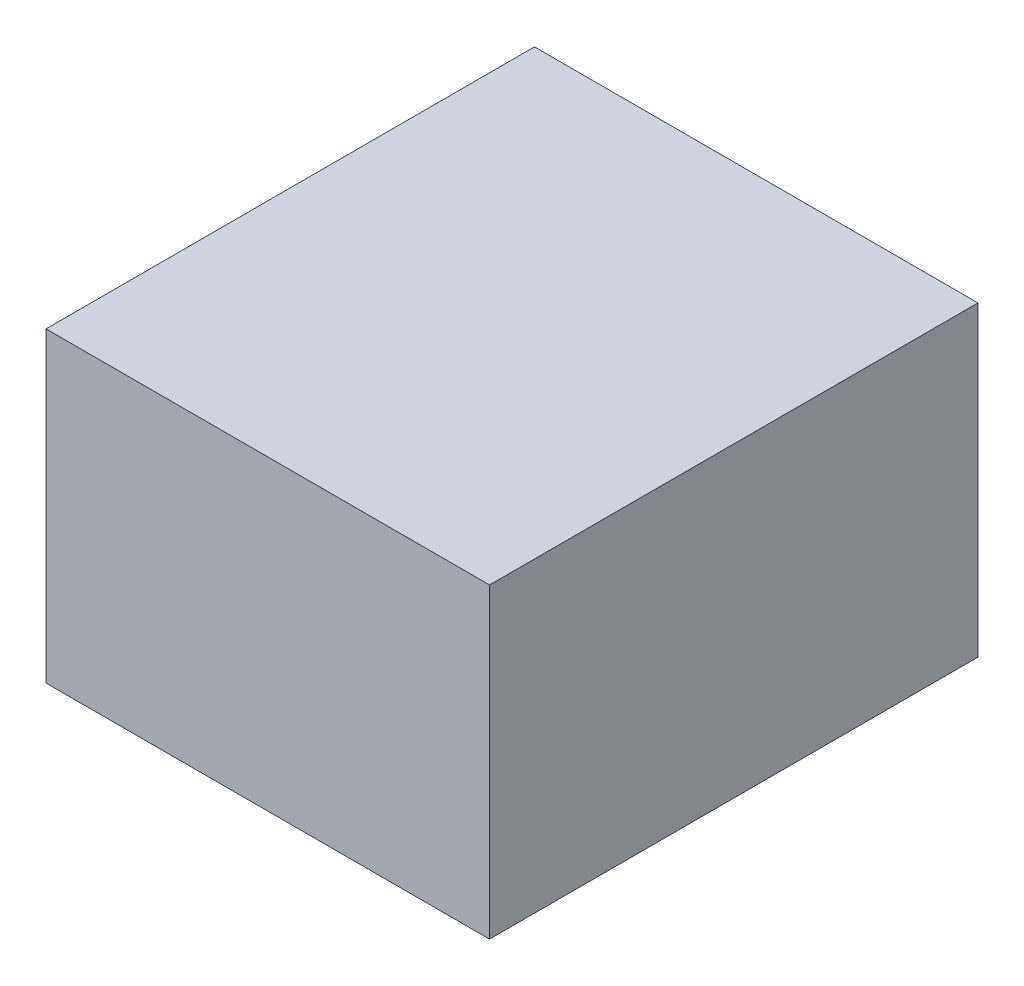
ISO-10303-21;
HEADER;
FILE_DESCRIPTION(('STEP AP214'),'2;1');
FILE_NAME('part.step','',(''),(''),'','','');
FILE_SCHEMA(('AUTOMOTIVE_DESIGN { 1 0 10303 214 1 1 1 1 }'));
ENDSEC;
DATA;
#1=APPLICATION_CONTEXT('core data for automotive mechanical design processes');
#2=APPLICATION_PROTOCOL_DEFINITION('international standard','automotive_design',2000,#1);
#3=PRODUCT_CONTEXT('',#1,'mechanical');
#4=PRODUCT('Part','Part','',(#3));
#5=PRODUCT_RELATED_PRODUCT_CATEGORY('part','',(#4));
#6=PRODUCT_DEFINITION_FORMATION('','',#4);
#7=PRODUCT_DEFINITION_CONTEXT('part definition',#1,'design');
#8=PRODUCT_DEFINITION('design','',#6,#7);
#9=PRODUCT_DEFINITION_SHAPE('','',#8);
#10=(LENGTH_UNIT() NAMED_UNIT(*) SI_UNIT(.MILLI.,.METRE.));
#11=(NAMED_UNIT(*) PLANE_ANGLE_UNIT() SI_UNIT($,.RADIAN.));
#12=(NAMED_UNIT(*) SI_UNIT($,.STERADIAN.) SOLID_ANGLE_UNIT());
#13=UNCERTAINTY_MEASURE_WITH_UNIT(LENGTH_MEASURE(1.E-05),#10,'distance_accuracy_value','');
#14=(GEOMETRIC_REPRESENTATION_CONTEXT(3) GLOBAL_UNCERTAINTY_ASSIGNED_CONTEXT((#13)) GLOBAL_UNIT_ASSIGNED_CONTEXT((#10,
#11,#12)) REPRESENTATION_CONTEXT('',''));
#15=CARTESIAN_POINT('',(0.,0.,0.));
#16=DIRECTION('',(0.,0.,1.));
#17=DIRECTION('',(1.,0.,0.));
#18=AXIS2_PLACEMENT_3D('',#15,#16,#17);
#19=CARTESIAN_POINT('',(45.4,62.8,50.));
#20=DIRECTION('',(-1.,0.,0.));
#21=DIRECTION('',(0.,0.,1.));
#22=AXIS2_PLACEMENT_3D('',#19,#20,#21);
#23=PLANE('',#22);
#24=DIRECTION('',(0.,0.,-1.));
#25=VECTOR('',#24,1.);
#26=CARTESIAN_POINT('',(45.4,0.,50.));
#27=LINE('',#26,#25);
#28=CARTESIAN_POINT('',(45.4,0.,50.));
#29=VERTEX_POINT('',#28);
#30=CARTESIAN_POINT('',(45.4,0.,-50.));
#31=VERTEX_POINT('',#30);
#32=EDGE_CURVE('E113',#29,#31,#27,.T.);
#33=ORIENTED_EDGE('',*,*,#32,.T.);
#34=DIRECTION('',(0.,-1.,0.));
#35=VECTOR('',#34,1.);
#36=CARTESIAN_POINT('',(45.4,62.8,-50.));
#37=LINE('',#36,#35);
#38=CARTESIAN_POINT('',(45.4,62.8,-50.));
#39=VERTEX_POINT('',#38);
#40=EDGE_CURVE('E11',#39,#31,#37,.T.);
#41=ORIENTED_EDGE('',*,*,#40,.F.);
#42=DIRECTION('',(0.,0.,-1.));
#43=VECTOR('',#42,1.);
#44=CARTESIAN_POINT('',(45.4,62.8,50.));
#45=LINE('',#44,#43);
#46=CARTESIAN_POINT('',(45.4,62.8,50.));
#47=VERTEX_POINT('',#46);
#48=EDGE_CURVE('E97',#47,#39,#45,.T.);
#49=ORIENTED_EDGE('',*,*,#48,.F.);
#50=DIRECTION('',(0.,-1.,0.));
#51=VECTOR('',#50,1.);
#52=CARTESIAN_POINT('',(45.4,62.8,50.));
#53=LINE('',#52,#51);
#54=EDGE_CURVE('E109',#47,#29,#53,.T.);
#55=ORIENTED_EDGE('',*,*,#54,.T.);
#56=EDGE_LOOP('',(#33,#41,#49,#55));
#57=FACE_BOUND('',#56,.T.);
#58=ADVANCED_FACE('F45',(#57),#23,.F.);
#59=CARTESIAN_POINT('',(-45.4,62.8,-50.));
#60=DIRECTION('',(0.,0.,1.));
#61=DIRECTION('',(1.,0.,0.));
#62=AXIS2_PLACEMENT_3D('',#59,#60,#61);
#63=PLANE('',#62);
#64=DIRECTION('',(-1.,0.,0.));
#65=VECTOR('',#64,1.);
#66=CARTESIAN_POINT('',(-45.4,0.,-50.));
#67=LINE('',#66,#65);
#68=CARTESIAN_POINT('',(-45.4,0.,-50.));
#69=VERTEX_POINT('',#68);
#70=EDGE_CURVE('E102',#31,#69,#67,.T.);
#71=ORIENTED_EDGE('',*,*,#70,.T.);
#72=DIRECTION('',(0.,-1.,0.));
#73=VECTOR('',#72,1.);
#74=CARTESIAN_POINT('',(-45.4,62.8,-50.));
#75=LINE('',#74,#73);
#76=CARTESIAN_POINT('',(-45.4,62.8,-50.));
#77=VERTEX_POINT('',#76);
#78=EDGE_CURVE('E54',#77,#69,#75,.T.);
#79=ORIENTED_EDGE('',*,*,#78,.F.);
#80=DIRECTION('',(-1.,0.,0.));
#81=VECTOR('',#80,1.);
#82=CARTESIAN_POINT('',(-45.4,62.8,-50.));
#83=LINE('',#82,#81);
#84=EDGE_CURVE('E92',#39,#77,#83,.T.);
#85=ORIENTED_EDGE('',*,*,#84,.F.);
#86=ORIENTED_EDGE('',*,*,#40,.T.);
#87=EDGE_LOOP('',(#71,#79,#85,#86));
#88=FACE_BOUND('',#87,.T.);
#89=ADVANCED_FACE('F101',(#88),#63,.F.);
#90=CARTESIAN_POINT('',(-45.4,62.8,50.));
#91=DIRECTION('',(1.,0.,0.));
#92=DIRECTION('',(0.,0.,-1.));
#93=AXIS2_PLACEMENT_3D('',#90,#91,#92);
#94=PLANE('',#93);
#95=DIRECTION('',(0.,0.,1.));
#96=VECTOR('',#95,1.);
#97=CARTESIAN_POINT('',(-45.4,0.,50.));
#98=LINE('',#97,#96);
#99=CARTESIAN_POINT('',(-45.4,0.,50.));
#100=VERTEX_POINT('',#99);
#101=EDGE_CURVE('E79',#69,#100,#98,.T.);
#102=ORIENTED_EDGE('',*,*,#101,.T.);
#103=DIRECTION('',(0.,-1.,0.));
#104=VECTOR('',#103,1.);
#105=CARTESIAN_POINT('',(-45.4,62.8,50.));
#106=LINE('',#105,#104);
#107=CARTESIAN_POINT('',(-45.4,62.8,50.));
#108=VERTEX_POINT('',#107);
#109=EDGE_CURVE('E104',#108,#100,#106,.T.);
#110=ORIENTED_EDGE('',*,*,#109,.F.);
#111=DIRECTION('',(0.,0.,1.));
#112=VECTOR('',#111,1.);
#113=CARTESIAN_POINT('',(-45.4,62.8,50.));
#114=LINE('',#113,#112);
#115=EDGE_CURVE('E95',#77,#108,#114,.T.);
#116=ORIENTED_EDGE('',*,*,#115,.F.);
#117=ORIENTED_EDGE('',*,*,#78,.T.);
#118=EDGE_LOOP('',(#102,#110,#116,#117));
#119=FACE_BOUND('',#118,.T.);
#120=ADVANCED_FACE('F105',(#119),#94,.F.);
#121=CARTESIAN_POINT('',(-45.4,62.8,50.));
#122=DIRECTION('',(0.,0.,-1.));
#123=DIRECTION('',(-1.,0.,0.));
#124=AXIS2_PLACEMENT_3D('',#121,#122,#123);
#125=PLANE('',#124);
#126=DIRECTION('',(1.,0.,0.));
#127=VECTOR('',#126,1.);
#128=CARTESIAN_POINT('',(-45.4,0.,50.));
#129=LINE('',#128,#127);
#130=EDGE_CURVE('E85',#100,#29,#129,.T.);
#131=ORIENTED_EDGE('',*,*,#130,.T.);
#132=ORIENTED_EDGE('',*,*,#54,.F.);
#133=DIRECTION('',(1.,0.,0.));
#134=VECTOR('',#133,1.);
#135=CARTESIAN_POINT('',(-45.4,62.8,50.));
#136=LINE('',#135,#134);
#137=EDGE_CURVE('E62',#108,#47,#136,.T.);
#138=ORIENTED_EDGE('',*,*,#137,.F.);
#139=ORIENTED_EDGE('',*,*,#109,.T.);
#140=EDGE_LOOP('',(#131,#132,#138,#139));
#141=FACE_BOUND('',#140,.T.);
#142=ADVANCED_FACE('F126',(#141),#125,.F.);
#143=CARTESIAN_POINT('',(0.,62.8,0.));
#144=DIRECTION('',(0.,-1.,0.));
#145=DIRECTION('',(0.,0.,-1.));
#146=AXIS2_PLACEMENT_3D('',#143,#144,#145);
#147=PLANE('',#146);
#148=ORIENTED_EDGE('',*,*,#48,.T.);
#149=ORIENTED_EDGE('',*,*,#84,.T.);
#150=ORIENTED_EDGE('',*,*,#115,.T.);
#151=ORIENTED_EDGE('',*,*,#137,.T.);
#152=EDGE_LOOP('',(#148,#149,#150,#151));
#153=FACE_BOUND('',#152,.T.);
#154=ADVANCED_FACE('F93',(#153),#147,.F.);
#155=CARTESIAN_POINT('',(0.,0.,0.));
#156=DIRECTION('',(0.,-1.,0.));
#157=DIRECTION('',(0.,0.,-1.));
#158=AXIS2_PLACEMENT_3D('',#155,#156,#157);
#159=PLANE('',#158);
#160=ORIENTED_EDGE('',*,*,#32,.F.);
#161=ORIENTED_EDGE('',*,*,#130,.F.);
#162=ORIENTED_EDGE('',*,*,#101,.F.);
#163=ORIENTED_EDGE('',*,*,#70,.F.);
#164=EDGE_LOOP('',(#160,#161,#162,#163));
#165=FACE_BOUND('',#164,.T.);
#166=ADVANCED_FACE('F129',(#165),#159,.T.);
#167=CLOSED_SHELL('',(#58,#89,#120,#142,#154,#166));
#168=MANIFOLD_SOLID_BREP('B2',#167);
#169=ADVANCED_BREP_SHAPE_REPRESENTATION('',(#18,#168),#14);
#170=SHAPE_DEFINITION_REPRESENTATION(#9,#169);
ENDSEC;
END-ISO-10303-21;
